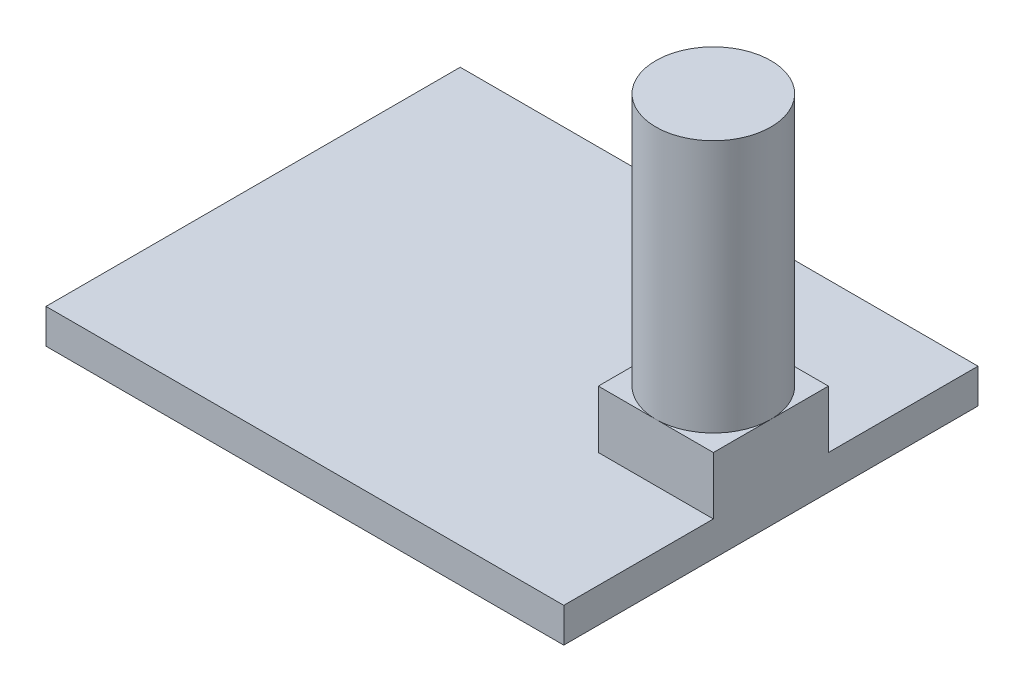
ISO-10303-21;
HEADER;
FILE_DESCRIPTION(('STEP AP214'),'2;1');
FILE_NAME('part.step','',(''),(''),'','','');
FILE_SCHEMA(('AUTOMOTIVE_DESIGN { 1 0 10303 214 1 1 1 1 }'));
ENDSEC;
DATA;
#1=APPLICATION_CONTEXT('core data for automotive mechanical design processes');
#2=APPLICATION_PROTOCOL_DEFINITION('international standard','automotive_design',2000,#1);
#3=PRODUCT_CONTEXT('',#1,'mechanical');
#4=PRODUCT('Part','Part','',(#3));
#5=PRODUCT_RELATED_PRODUCT_CATEGORY('part','',(#4));
#6=PRODUCT_DEFINITION_FORMATION('','',#4);
#7=PRODUCT_DEFINITION_CONTEXT('part definition',#1,'design');
#8=PRODUCT_DEFINITION('design','',#6,#7);
#9=PRODUCT_DEFINITION_SHAPE('','',#8);
#10=(LENGTH_UNIT() NAMED_UNIT(*) SI_UNIT(.MILLI.,.METRE.));
#11=(NAMED_UNIT(*) PLANE_ANGLE_UNIT() SI_UNIT($,.RADIAN.));
#12=(NAMED_UNIT(*) SI_UNIT($,.STERADIAN.) SOLID_ANGLE_UNIT());
#13=UNCERTAINTY_MEASURE_WITH_UNIT(LENGTH_MEASURE(1.E-05),#10,'distance_accuracy_value','');
#14=(GEOMETRIC_REPRESENTATION_CONTEXT(3) GLOBAL_UNCERTAINTY_ASSIGNED_CONTEXT((#13)) GLOBAL_UNIT_ASSIGNED_CONTEXT((#10,
#11,#12)) REPRESENTATION_CONTEXT('',''));
#15=CARTESIAN_POINT('',(0.,0.,0.));
#16=DIRECTION('',(0.,0.,1.));
#17=DIRECTION('',(1.,0.,0.));
#18=AXIS2_PLACEMENT_3D('',#15,#16,#17);
#19=CARTESIAN_POINT('',(0.,8.,0.));
#20=DIRECTION('',(0.,1.,0.));
#21=DIRECTION('',(0.,0.,1.));
#22=AXIS2_PLACEMENT_3D('',#19,#20,#21);
#23=PLANE('',#22);
#24=DIRECTION('',(-1.,0.,0.));
#25=VECTOR('',#24,1.);
#26=CARTESIAN_POINT('',(22.5,8.,5.));
#27=LINE('',#26,#25);
#28=CARTESIAN_POINT('',(17.5,8.,5.));
#29=VERTEX_POINT('',#28);
#30=CARTESIAN_POINT('',(12.5,8.,5.));
#31=VERTEX_POINT('',#30);
#32=EDGE_CURVE('E161',#29,#31,#27,.T.);
#33=ORIENTED_EDGE('',*,*,#32,.F.);
#34=CARTESIAN_POINT('',(17.5,8.,0.));
#35=DIRECTION('',(0.,1.,0.));
#36=DIRECTION('',(0.,0.,1.));
#37=AXIS2_PLACEMENT_3D('',#34,#35,#36);
#38=CIRCLE('',#37,5.);
#39=CARTESIAN_POINT('',(12.5,8.,0.));
#40=VERTEX_POINT('',#39);
#41=EDGE_CURVE('E67',#29,#40,#38,.F.);
#42=ORIENTED_EDGE('',*,*,#41,.T.);
#43=DIRECTION('',(0.,0.,1.));
#44=VECTOR('',#43,1.);
#45=CARTESIAN_POINT('',(12.5,8.,-5.));
#46=LINE('',#45,#44);
#47=EDGE_CURVE('E166',#40,#31,#46,.T.);
#48=ORIENTED_EDGE('',*,*,#47,.T.);
#49=EDGE_LOOP('',(#33,#42,#48));
#50=FACE_BOUND('',#49,.T.);
#51=ADVANCED_FACE('F52',(#50),#23,.T.);
#52=CARTESIAN_POINT('',(12.5,8.,-5.));
#53=VERTEX_POINT('',#52);
#54=EDGE_CURVE('E167',#53,#40,#46,.T.);
#55=ORIENTED_EDGE('',*,*,#54,.T.);
#56=CARTESIAN_POINT('',(17.5,8.,-5.));
#57=VERTEX_POINT('',#56);
#58=EDGE_CURVE('E148',#40,#57,#38,.F.);
#59=ORIENTED_EDGE('',*,*,#58,.T.);
#60=DIRECTION('',(-1.,0.,0.));
#61=VECTOR('',#60,1.);
#62=CARTESIAN_POINT('',(22.5,8.,-5.));
#63=LINE('',#62,#61);
#64=EDGE_CURVE('E170',#57,#53,#63,.T.);
#65=ORIENTED_EDGE('',*,*,#64,.T.);
#66=EDGE_LOOP('',(#55,#59,#65));
#67=FACE_BOUND('',#66,.T.);
#68=ADVANCED_FACE('F236',(#67),#23,.T.);
#69=CARTESIAN_POINT('',(22.5,8.,-5.));
#70=VERTEX_POINT('',#69);
#71=EDGE_CURVE('E147',#70,#57,#63,.T.);
#72=ORIENTED_EDGE('',*,*,#71,.T.);
#73=CARTESIAN_POINT('',(22.5,8.,0.));
#74=VERTEX_POINT('',#73);
#75=EDGE_CURVE('E132',#57,#74,#38,.F.);
#76=ORIENTED_EDGE('',*,*,#75,.T.);
#77=DIRECTION('',(0.,0.,1.));
#78=VECTOR('',#77,1.);
#79=CARTESIAN_POINT('',(22.5,8.,-5.));
#80=LINE('',#79,#78);
#81=EDGE_CURVE('E145',#70,#74,#80,.T.);
#82=ORIENTED_EDGE('',*,*,#81,.F.);
#83=EDGE_LOOP('',(#72,#76,#82));
#84=FACE_BOUND('',#83,.T.);
#85=ADVANCED_FACE('F143',(#84),#23,.T.);
#86=CARTESIAN_POINT('',(22.5,3.,18.));
#87=DIRECTION('',(-1.,0.,0.));
#88=DIRECTION('',(0.,0.,1.));
#89=AXIS2_PLACEMENT_3D('',#86,#87,#88);
#90=PLANE('',#89);
#91=ORIENTED_EDGE('',*,*,#81,.T.);
#92=CARTESIAN_POINT('',(22.5,8.,5.));
#93=VERTEX_POINT('',#92);
#94=EDGE_CURVE('E149',#74,#93,#80,.T.);
#95=ORIENTED_EDGE('',*,*,#94,.T.);
#96=DIRECTION('',(0.,-1.,0.));
#97=VECTOR('',#96,1.);
#98=CARTESIAN_POINT('',(22.5,8.,5.));
#99=LINE('',#98,#97);
#100=CARTESIAN_POINT('',(22.5,3.,5.));
#101=VERTEX_POINT('',#100);
#102=EDGE_CURVE('E172',#93,#101,#99,.T.);
#103=ORIENTED_EDGE('',*,*,#102,.T.);
#104=DIRECTION('',(0.,0.,-1.));
#105=VECTOR('',#104,1.);
#106=CARTESIAN_POINT('',(22.5,3.,18.));
#107=LINE('',#106,#105);
#108=CARTESIAN_POINT('',(22.5,3.,18.));
#109=VERTEX_POINT('',#108);
#110=EDGE_CURVE('E185',#109,#101,#107,.T.);
#111=ORIENTED_EDGE('',*,*,#110,.F.);
#112=DIRECTION('',(0.,-1.,0.));
#113=VECTOR('',#112,1.);
#114=CARTESIAN_POINT('',(22.5,3.,18.));
#115=LINE('',#114,#113);
#116=CARTESIAN_POINT('',(22.5,0.,18.));
#117=VERTEX_POINT('',#116);
#118=EDGE_CURVE('E194',#109,#117,#115,.T.);
#119=ORIENTED_EDGE('',*,*,#118,.T.);
#120=DIRECTION('',(0.,0.,-1.));
#121=VECTOR('',#120,1.);
#122=CARTESIAN_POINT('',(22.5,0.,18.));
#123=LINE('',#122,#121);
#124=CARTESIAN_POINT('',(22.5,0.,-18.));
#125=VERTEX_POINT('',#124);
#126=EDGE_CURVE('E178',#117,#125,#123,.T.);
#127=ORIENTED_EDGE('',*,*,#126,.T.);
#128=DIRECTION('',(0.,-1.,0.));
#129=VECTOR('',#128,1.);
#130=CARTESIAN_POINT('',(22.5,3.,-18.));
#131=LINE('',#130,#129);
#132=CARTESIAN_POINT('',(22.5,3.,-18.));
#133=VERTEX_POINT('',#132);
#134=EDGE_CURVE('E12',#133,#125,#131,.T.);
#135=ORIENTED_EDGE('',*,*,#134,.F.);
#136=CARTESIAN_POINT('',(22.5,3.,-5.));
#137=VERTEX_POINT('',#136);
#138=EDGE_CURVE('E188',#137,#133,#107,.T.);
#139=ORIENTED_EDGE('',*,*,#138,.F.);
#140=DIRECTION('',(0.,-1.,0.));
#141=VECTOR('',#140,1.);
#142=CARTESIAN_POINT('',(22.5,8.,-5.));
#143=LINE('',#142,#141);
#144=EDGE_CURVE('E160',#70,#137,#143,.T.);
#145=ORIENTED_EDGE('',*,*,#144,.F.);
#146=EDGE_LOOP('',(#91,#95,#103,#111,#119,#127,#135,#139,#145));
#147=FACE_BOUND('',#146,.T.);
#148=ADVANCED_FACE('F54',(#147),#90,.F.);
#149=CARTESIAN_POINT('',(-22.5,3.,-18.));
#150=DIRECTION('',(0.,0.,1.));
#151=DIRECTION('',(1.,0.,0.));
#152=AXIS2_PLACEMENT_3D('',#149,#150,#151);
#153=PLANE('',#152);
#154=DIRECTION('',(-1.,0.,0.));
#155=VECTOR('',#154,1.);
#156=CARTESIAN_POINT('',(-22.5,0.,-18.));
#157=LINE('',#156,#155);
#158=CARTESIAN_POINT('',(-22.5,0.,-18.));
#159=VERTEX_POINT('',#158);
#160=EDGE_CURVE('E197',#125,#159,#157,.T.);
#161=ORIENTED_EDGE('',*,*,#160,.T.);
#162=DIRECTION('',(0.,-1.,0.));
#163=VECTOR('',#162,1.);
#164=CARTESIAN_POINT('',(-22.5,3.,-18.));
#165=LINE('',#164,#163);
#166=CARTESIAN_POINT('',(-22.5,3.,-18.));
#167=VERTEX_POINT('',#166);
#168=EDGE_CURVE('E60',#167,#159,#165,.T.);
#169=ORIENTED_EDGE('',*,*,#168,.F.);
#170=DIRECTION('',(-1.,0.,0.));
#171=VECTOR('',#170,1.);
#172=CARTESIAN_POINT('',(-22.5,3.,-18.));
#173=LINE('',#172,#171);
#174=EDGE_CURVE('E187',#133,#167,#173,.T.);
#175=ORIENTED_EDGE('',*,*,#174,.F.);
#176=ORIENTED_EDGE('',*,*,#134,.T.);
#177=EDGE_LOOP('',(#161,#169,#175,#176));
#178=FACE_BOUND('',#177,.T.);
#179=ADVANCED_FACE('F229',(#178),#153,.F.);
#180=CARTESIAN_POINT('',(-22.5,3.,18.));
#181=DIRECTION('',(1.,0.,0.));
#182=DIRECTION('',(0.,0.,-1.));
#183=AXIS2_PLACEMENT_3D('',#180,#181,#182);
#184=PLANE('',#183);
#185=DIRECTION('',(0.,0.,1.));
#186=VECTOR('',#185,1.);
#187=CARTESIAN_POINT('',(-22.5,0.,18.));
#188=LINE('',#187,#186);
#189=CARTESIAN_POINT('',(-22.5,0.,18.));
#190=VERTEX_POINT('',#189);
#191=EDGE_CURVE('E199',#159,#190,#188,.T.);
#192=ORIENTED_EDGE('',*,*,#191,.T.);
#193=DIRECTION('',(0.,-1.,0.));
#194=VECTOR('',#193,1.);
#195=CARTESIAN_POINT('',(-22.5,3.,18.));
#196=LINE('',#195,#194);
#197=CARTESIAN_POINT('',(-22.5,3.,18.));
#198=VERTEX_POINT('',#197);
#199=EDGE_CURVE('E205',#198,#190,#196,.T.);
#200=ORIENTED_EDGE('',*,*,#199,.F.);
#201=DIRECTION('',(0.,0.,1.));
#202=VECTOR('',#201,1.);
#203=CARTESIAN_POINT('',(-22.5,3.,18.));
#204=LINE('',#203,#202);
#205=EDGE_CURVE('E190',#167,#198,#204,.T.);
#206=ORIENTED_EDGE('',*,*,#205,.F.);
#207=ORIENTED_EDGE('',*,*,#168,.T.);
#208=EDGE_LOOP('',(#192,#200,#206,#207));
#209=FACE_BOUND('',#208,.T.);
#210=ADVANCED_FACE('F212',(#209),#184,.F.);
#211=CARTESIAN_POINT('',(-22.5,3.,18.));
#212=DIRECTION('',(0.,0.,-1.));
#213=DIRECTION('',(-1.,0.,0.));
#214=AXIS2_PLACEMENT_3D('',#211,#212,#213);
#215=PLANE('',#214);
#216=DIRECTION('',(1.,0.,0.));
#217=VECTOR('',#216,1.);
#218=CARTESIAN_POINT('',(-22.5,0.,18.));
#219=LINE('',#218,#217);
#220=EDGE_CURVE('E201',#190,#117,#219,.T.);
#221=ORIENTED_EDGE('',*,*,#220,.T.);
#222=ORIENTED_EDGE('',*,*,#118,.F.);
#223=DIRECTION('',(1.,0.,0.));
#224=VECTOR('',#223,1.);
#225=CARTESIAN_POINT('',(-22.5,3.,18.));
#226=LINE('',#225,#224);
#227=EDGE_CURVE('E192',#198,#109,#226,.T.);
#228=ORIENTED_EDGE('',*,*,#227,.F.);
#229=ORIENTED_EDGE('',*,*,#199,.T.);
#230=EDGE_LOOP('',(#221,#222,#228,#229));
#231=FACE_BOUND('',#230,.T.);
#232=ADVANCED_FACE('F222',(#231),#215,.F.);
#233=CARTESIAN_POINT('',(0.,3.,0.));
#234=DIRECTION('',(0.,-1.,0.));
#235=DIRECTION('',(0.,0.,-1.));
#236=AXIS2_PLACEMENT_3D('',#233,#234,#235);
#237=PLANE('',#236);
#238=ORIENTED_EDGE('',*,*,#110,.T.);
#239=DIRECTION('',(-1.,0.,0.));
#240=VECTOR('',#239,1.);
#241=CARTESIAN_POINT('',(22.5,3.,5.));
#242=LINE('',#241,#240);
#243=CARTESIAN_POINT('',(12.5,3.,5.));
#244=VERTEX_POINT('',#243);
#245=EDGE_CURVE('E173',#101,#244,#242,.T.);
#246=ORIENTED_EDGE('',*,*,#245,.T.);
#247=DIRECTION('',(0.,0.,1.));
#248=VECTOR('',#247,1.);
#249=CARTESIAN_POINT('',(12.5,3.,-5.));
#250=LINE('',#249,#248);
#251=CARTESIAN_POINT('',(12.5,3.,-5.));
#252=VERTEX_POINT('',#251);
#253=EDGE_CURVE('E75',#252,#244,#250,.T.);
#254=ORIENTED_EDGE('',*,*,#253,.F.);
#255=DIRECTION('',(-1.,0.,0.));
#256=VECTOR('',#255,1.);
#257=CARTESIAN_POINT('',(22.5,3.,-5.));
#258=LINE('',#257,#256);
#259=EDGE_CURVE('E156',#137,#252,#258,.T.);
#260=ORIENTED_EDGE('',*,*,#259,.F.);
#261=ORIENTED_EDGE('',*,*,#138,.T.);
#262=ORIENTED_EDGE('',*,*,#174,.T.);
#263=ORIENTED_EDGE('',*,*,#205,.T.);
#264=ORIENTED_EDGE('',*,*,#227,.T.);
#265=EDGE_LOOP('',(#238,#246,#254,#260,#261,#262,#263,#264));
#266=FACE_BOUND('',#265,.T.);
#267=ADVANCED_FACE('F228',(#266),#237,.F.);
#268=CARTESIAN_POINT('',(0.,0.,0.));
#269=DIRECTION('',(0.,-1.,0.));
#270=DIRECTION('',(0.,0.,-1.));
#271=AXIS2_PLACEMENT_3D('',#268,#269,#270);
#272=PLANE('',#271);
#273=ORIENTED_EDGE('',*,*,#126,.F.);
#274=ORIENTED_EDGE('',*,*,#220,.F.);
#275=ORIENTED_EDGE('',*,*,#191,.F.);
#276=ORIENTED_EDGE('',*,*,#160,.F.);
#277=EDGE_LOOP('',(#273,#274,#275,#276));
#278=FACE_BOUND('',#277,.T.);
#279=ADVANCED_FACE('F219',(#278),#272,.T.);
#280=ORIENTED_EDGE('',*,*,#94,.F.);
#281=EDGE_CURVE('E128',#74,#29,#38,.F.);
#282=ORIENTED_EDGE('',*,*,#281,.T.);
#283=EDGE_CURVE('E152',#93,#29,#27,.T.);
#284=ORIENTED_EDGE('',*,*,#283,.F.);
#285=EDGE_LOOP('',(#280,#282,#284));
#286=FACE_BOUND('',#285,.T.);
#287=ADVANCED_FACE('F150',(#286),#23,.T.);
#288=CARTESIAN_POINT('',(22.5,8.,-5.));
#289=DIRECTION('',(0.,0.,1.));
#290=DIRECTION('',(1.,0.,0.));
#291=AXIS2_PLACEMENT_3D('',#288,#289,#290);
#292=PLANE('',#291);
#293=ORIENTED_EDGE('',*,*,#259,.T.);
#294=DIRECTION('',(0.,-1.,0.));
#295=VECTOR('',#294,1.);
#296=CARTESIAN_POINT('',(12.5,8.,-5.));
#297=LINE('',#296,#295);
#298=EDGE_CURVE('E179',#53,#252,#297,.T.);
#299=ORIENTED_EDGE('',*,*,#298,.F.);
#300=ORIENTED_EDGE('',*,*,#64,.F.);
#301=ORIENTED_EDGE('',*,*,#71,.F.);
#302=ORIENTED_EDGE('',*,*,#144,.T.);
#303=EDGE_LOOP('',(#293,#299,#300,#301,#302));
#304=FACE_BOUND('',#303,.T.);
#305=ADVANCED_FACE('F231',(#304),#292,.F.);
#306=CARTESIAN_POINT('',(12.5,8.,-5.));
#307=DIRECTION('',(1.,0.,0.));
#308=DIRECTION('',(0.,0.,-1.));
#309=AXIS2_PLACEMENT_3D('',#306,#307,#308);
#310=PLANE('',#309);
#311=ORIENTED_EDGE('',*,*,#253,.T.);
#312=DIRECTION('',(0.,-1.,0.));
#313=VECTOR('',#312,1.);
#314=CARTESIAN_POINT('',(12.5,8.,5.));
#315=LINE('',#314,#313);
#316=EDGE_CURVE('E181',#31,#244,#315,.T.);
#317=ORIENTED_EDGE('',*,*,#316,.F.);
#318=ORIENTED_EDGE('',*,*,#47,.F.);
#319=ORIENTED_EDGE('',*,*,#54,.F.);
#320=ORIENTED_EDGE('',*,*,#298,.T.);
#321=EDGE_LOOP('',(#311,#317,#318,#319,#320));
#322=FACE_BOUND('',#321,.T.);
#323=ADVANCED_FACE('F239',(#322),#310,.F.);
#324=CARTESIAN_POINT('',(22.5,8.,5.));
#325=DIRECTION('',(0.,0.,1.));
#326=DIRECTION('',(1.,0.,0.));
#327=AXIS2_PLACEMENT_3D('',#324,#325,#326);
#328=PLANE('',#327);
#329=ORIENTED_EDGE('',*,*,#283,.T.);
#330=ORIENTED_EDGE('',*,*,#32,.T.);
#331=ORIENTED_EDGE('',*,*,#316,.T.);
#332=ORIENTED_EDGE('',*,*,#245,.F.);
#333=ORIENTED_EDGE('',*,*,#102,.F.);
#334=EDGE_LOOP('',(#329,#330,#331,#332,#333));
#335=FACE_BOUND('',#334,.T.);
#336=ADVANCED_FACE('F241',(#335),#328,.T.);
#337=CARTESIAN_POINT('',(17.5,30.,0.));
#338=DIRECTION('',(0.,-1.,0.));
#339=DIRECTION('',(0.,0.,-1.));
#340=AXIS2_PLACEMENT_3D('',#337,#338,#339);
#341=CYLINDRICAL_SURFACE('',#340,5.);
#342=ORIENTED_EDGE('',*,*,#41,.F.);
#343=ORIENTED_EDGE('',*,*,#281,.F.);
#344=ORIENTED_EDGE('',*,*,#75,.F.);
#345=ORIENTED_EDGE('',*,*,#58,.F.);
#346=EDGE_LOOP('',(#342,#343,#344,#345));
#347=FACE_BOUND('',#346,.T.);
#348=CARTESIAN_POINT('',(17.5,30.,0.));
#349=DIRECTION('',(0.,1.,0.));
#350=DIRECTION('',(0.,0.,1.));
#351=AXIS2_PLACEMENT_3D('',#348,#349,#350);
#352=CIRCLE('',#351,5.);
#353=CARTESIAN_POINT('',(17.5,30.,5.));
#354=VERTEX_POINT('',#353);
#355=EDGE_CURVE('E138',#354,#354,#352,.T.);
#356=ORIENTED_EDGE('',*,*,#355,.F.);
#357=EDGE_LOOP('',(#356));
#358=FACE_BOUND('',#357,.T.);
#359=ADVANCED_FACE('F130',(#347,#358),#341,.T.);
#360=CARTESIAN_POINT('',(17.5,30.,0.));
#361=DIRECTION('',(0.,1.,0.));
#362=DIRECTION('',(0.,0.,1.));
#363=AXIS2_PLACEMENT_3D('',#360,#361,#362);
#364=PLANE('',#363);
#365=ORIENTED_EDGE('',*,*,#355,.T.);
#366=EDGE_LOOP('',(#365));
#367=FACE_BOUND('',#366,.T.);
#368=ADVANCED_FACE('F248',(#367),#364,.T.);
#369=CLOSED_SHELL('',(#51,#68,#85,#148,#179,#210,#232,#267,#279,#287,#305,#323,#336,#359,#368));
#370=MANIFOLD_SOLID_BREP('B2',#369);
#371=ADVANCED_BREP_SHAPE_REPRESENTATION('',(#18,#370),#14);
#372=SHAPE_DEFINITION_REPRESENTATION(#9,#371);
ENDSEC;
END-ISO-10303-21;
